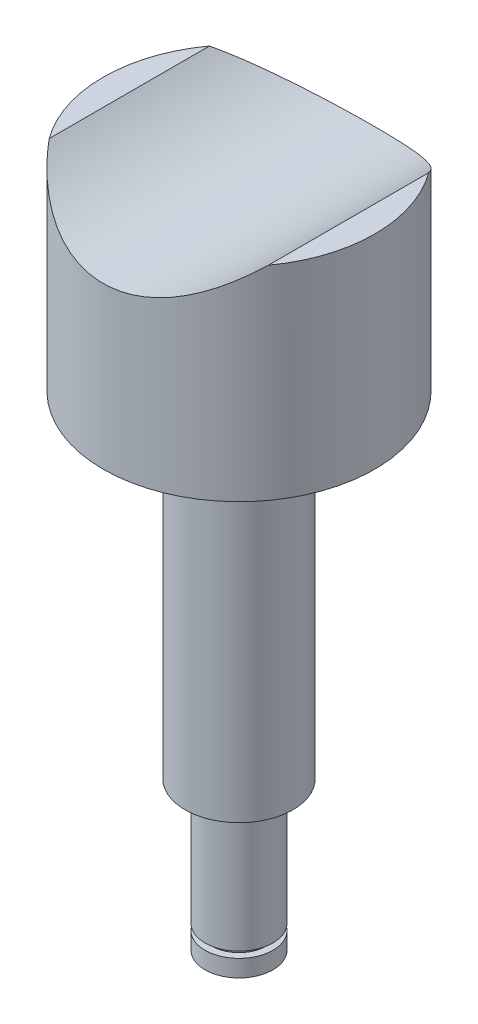
ISO-10303-21;
HEADER;
FILE_DESCRIPTION(('STEP AP214'),'2;1');
FILE_NAME('part.step','',(''),(''),'','','');
FILE_SCHEMA(('AUTOMOTIVE_DESIGN { 1 0 10303 214 1 1 1 1 }'));
ENDSEC;
DATA;
#1=APPLICATION_CONTEXT('core data for automotive mechanical design processes');
#2=APPLICATION_PROTOCOL_DEFINITION('international standard','automotive_design',2000,#1);
#3=PRODUCT_CONTEXT('',#1,'mechanical');
#4=PRODUCT('Part','Part','',(#3));
#5=PRODUCT_RELATED_PRODUCT_CATEGORY('part','',(#4));
#6=PRODUCT_DEFINITION_FORMATION('','',#4);
#7=PRODUCT_DEFINITION_CONTEXT('part definition',#1,'design');
#8=PRODUCT_DEFINITION('design','',#6,#7);
#9=PRODUCT_DEFINITION_SHAPE('','',#8);
#10=(LENGTH_UNIT() NAMED_UNIT(*) SI_UNIT(.MILLI.,.METRE.));
#11=(NAMED_UNIT(*) PLANE_ANGLE_UNIT() SI_UNIT($,.RADIAN.));
#12=(NAMED_UNIT(*) SI_UNIT($,.STERADIAN.) SOLID_ANGLE_UNIT());
#13=UNCERTAINTY_MEASURE_WITH_UNIT(LENGTH_MEASURE(1.E-05),#10,'distance_accuracy_value','');
#14=(GEOMETRIC_REPRESENTATION_CONTEXT(3) GLOBAL_UNCERTAINTY_ASSIGNED_CONTEXT((#13)) GLOBAL_UNIT_ASSIGNED_CONTEXT((#10,
#11,#12)) REPRESENTATION_CONTEXT('',''));
#15=CARTESIAN_POINT('',(0.,0.,0.));
#16=DIRECTION('',(0.,0.,1.));
#17=DIRECTION('',(1.,0.,0.));
#18=AXIS2_PLACEMENT_3D('',#15,#16,#17);
#19=CARTESIAN_POINT('',(0.,-57.07,0.));
#20=DIRECTION('',(0.,1.,0.));
#21=DIRECTION('',(0.,0.,1.));
#22=AXIS2_PLACEMENT_3D('',#19,#20,#21);
#23=CYLINDRICAL_SURFACE('',#22,4.);
#24=CARTESIAN_POINT('',(0.,-39.57,0.));
#25=DIRECTION('',(0.,-1.,0.));
#26=DIRECTION('',(0.,0.,-1.));
#27=AXIS2_PLACEMENT_3D('',#24,#25,#26);
#28=CIRCLE('',#27,4.);
#29=CARTESIAN_POINT('',(0.,-39.57,-4.));
#30=VERTEX_POINT('',#29);
#31=EDGE_CURVE('E71',#30,#30,#28,.T.);
#32=ORIENTED_EDGE('',*,*,#31,.T.);
#33=EDGE_LOOP('',(#32));
#34=FACE_BOUND('',#33,.T.);
#35=CARTESIAN_POINT('',(0.,-54.33,0.));
#36=DIRECTION('',(0.,-1.,0.));
#37=DIRECTION('',(0.,0.,-1.));
#38=AXIS2_PLACEMENT_3D('',#35,#36,#37);
#39=CIRCLE('',#38,4.);
#40=CARTESIAN_POINT('',(0.,-54.33,-4.));
#41=VERTEX_POINT('',#40);
#42=EDGE_CURVE('E38',#41,#41,#39,.T.);
#43=ORIENTED_EDGE('',*,*,#42,.F.);
#44=EDGE_LOOP('',(#43));
#45=FACE_BOUND('',#44,.T.);
#46=ADVANCED_FACE('F33',(#34,#45),#23,.T.);
#47=CARTESIAN_POINT('',(0.,24.,0.));
#48=DIRECTION('',(0.,1.,0.));
#49=DIRECTION('',(0.,0.,1.));
#50=AXIS2_PLACEMENT_3D('',#47,#48,#49);
#51=PLANE('',#50);
#52=DIRECTION('',(0.,0.,1.));
#53=VECTOR('',#52,1.);
#54=CARTESIAN_POINT('',(-12.9190750442901,24.,-16.));
#55=LINE('',#54,#53);
#56=CARTESIAN_POINT('',(-12.9190750442901,24.,-9.43914720724282));
#57=VERTEX_POINT('',#56);
#58=CARTESIAN_POINT('',(-12.9190750442901,24.,9.43914720724282));
#59=VERTEX_POINT('',#58);
#60=EDGE_CURVE('E11',#57,#59,#55,.T.);
#61=ORIENTED_EDGE('',*,*,#60,.F.);
#62=CARTESIAN_POINT('',(0.,24.,0.));
#63=DIRECTION('',(0.,1.,0.));
#64=DIRECTION('',(0.,0.,1.));
#65=AXIS2_PLACEMENT_3D('',#62,#63,#64);
#66=CIRCLE('',#65,16.);
#67=EDGE_CURVE('E66',#57,#59,#66,.T.);
#68=ORIENTED_EDGE('',*,*,#67,.T.);
#69=EDGE_LOOP('',(#61,#68));
#70=FACE_BOUND('',#69,.T.);
#71=ADVANCED_FACE('F133',(#70),#51,.T.);
#72=CARTESIAN_POINT('',(0.,24.,0.));
#73=DIRECTION('',(0.,-1.,0.));
#74=DIRECTION('',(0.,0.,-1.));
#75=AXIS2_PLACEMENT_3D('',#72,#73,#74);
#76=CYLINDRICAL_SURFACE('',#75,16.);
#77=CARTESIAN_POINT('',(12.9190750442901,24.,9.43914720724282));
#78=VERTEX_POINT('',#77);
#79=CARTESIAN_POINT('',(12.9190750442901,24.,-9.43914720724282));
#80=VERTEX_POINT('',#79);
#81=EDGE_CURVE('E64',#78,#80,#66,.T.);
#82=ORIENTED_EDGE('',*,*,#81,.F.);
#83=CARTESIAN_POINT('',(12.9190750442901,24.,9.43914720724282));
#84=CARTESIAN_POINT('',(12.7848745001724,23.8761583557703,9.62280970922538));
#85=CARTESIAN_POINT('',(12.6467891641811,23.752310488911,9.80359435033626));
#86=CARTESIAN_POINT('',(12.3628092535599,23.5052124607396,10.1593710354687));
#87=CARTESIAN_POINT('',(12.2169141322659,23.3819623419287,10.3343626726044));
#88=CARTESIAN_POINT('',(11.7671642976749,23.013788655781,10.8509215085894));
#89=CARTESIAN_POINT('',(11.4515310504343,22.7707083999413,11.1836808844152));
#90=CARTESIAN_POINT('',(10.786241112084,22.292396119069,11.826784210597));
#91=CARTESIAN_POINT('',(10.4363246798641,22.0572456050393,12.1369200712997));
#92=CARTESIAN_POINT('',(9.70491021094698,21.6017485773638,12.7293353217599));
#93=CARTESIAN_POINT('',(9.32342920414841,21.3813941955898,13.0116295548882));
#94=CARTESIAN_POINT('',(8.6119302918267,21.0040021911267,13.4899319557024));
#95=CARTESIAN_POINT('',(8.28769188992414,20.8433226617135,13.6916804147402));
#96=CARTESIAN_POINT('',(7.62029759857008,20.5366561014405,14.0740515301925));
#97=CARTESIAN_POINT('',(7.27714256924571,20.3906684034039,14.2546751459765));
#98=CARTESIAN_POINT('',(6.57390793423437,20.1162562003025,14.5923073857071));
#99=CARTESIAN_POINT('',(6.21387691990333,19.9877849876245,14.7493789274354));
#100=CARTESIAN_POINT('',(5.4775768478831,19.750390612657,15.0383687013548));
#101=CARTESIAN_POINT('',(5.10130784483666,19.6414673845927,15.1702870181814));
#102=CARTESIAN_POINT('',(4.33085324490416,19.4445196642634,15.4080444053685));
#103=CARTESIAN_POINT('',(3.93652581885725,19.3567156967325,15.5136086887214));
#104=CARTESIAN_POINT('',(3.1364381569893,19.2055602726033,15.6949347024083));
#105=CARTESIAN_POINT('',(2.73067779239335,19.1422090915472,15.7706960969137));
#106=CARTESIAN_POINT('',(1.91141192442762,19.0416435230316,15.8908105487804));
#107=CARTESIAN_POINT('',(1.49790827828065,19.0044229485463,15.9351710410527));
#108=CARTESIAN_POINT('',(0.667179964686915,18.957143948551,15.9915010830839));
#109=CARTESIAN_POINT('',(0.2499558715571,18.9470814011261,16.0034755482392));
#110=CARTESIAN_POINT('',(-0.523849027104041,18.9538563569469,15.9954080056797));
#111=CARTESIAN_POINT('',(-0.880519589543668,18.9670324150639,15.9797238955904));
#112=CARTESIAN_POINT('',(-1.59070567118655,19.0131958112954,15.9247122492311));
#113=CARTESIAN_POINT('',(-1.9442215519164,19.0461808489253,15.8853874584339));
#114=CARTESIAN_POINT('',(-2.64549912365194,19.1312800489046,15.7837531068547));
#115=CARTESIAN_POINT('',(-2.9932620119545,19.1833901772911,15.7214483931029));
#116=CARTESIAN_POINT('',(-3.68085735219408,19.3057296582209,15.5748154528326));
#117=CARTESIAN_POINT('',(-4.0206894699718,19.3759597727437,15.4904863001431));
#118=CARTESIAN_POINT('',(-4.68746831588913,19.5325587640499,15.3018503663848));
#119=CARTESIAN_POINT('',(-5.01450324870717,19.6187773126467,15.1977294620245));
#120=CARTESIAN_POINT('',(-5.65733509226059,19.8063424220213,14.9703309069064));
#121=CARTESIAN_POINT('',(-5.9731323736633,19.9076884832532,14.8470538887228));
#122=CARTESIAN_POINT('',(-6.59256235699274,20.1240850380026,14.5825794085774));
#123=CARTESIAN_POINT('',(-6.89618575757643,20.2391457531294,14.4413685752436));
#124=CARTESIAN_POINT('',(-7.49019632177865,20.4813699721994,14.1424032312224));
#125=CARTESIAN_POINT('',(-7.78058080643954,20.608535909757,13.9846453932999));
#126=CARTESIAN_POINT('',(-8.4716676918878,20.9314417308649,13.5813673069357));
#127=CARTESIAN_POINT('',(-8.86499511436966,21.1328252297615,13.327667013196));
#128=CARTESIAN_POINT('',(-9.62204756133403,21.5529247676398,12.7918516129014));
#129=CARTESIAN_POINT('',(-9.98575839234745,21.7716490190637,12.5097230255879));
#130=CARTESIAN_POINT('',(-10.6830317259132,22.2219279529263,11.9197901714817));
#131=CARTESIAN_POINT('',(-11.0165955856249,22.4534820570317,11.6119870617081));
#132=CARTESIAN_POINT('',(-11.6534098230203,22.9249429524403,10.9727612169663));
#133=CARTESIAN_POINT('',(-11.9566761720734,23.164845252085,10.6413510859996));
#134=CARTESIAN_POINT('',(-12.3623361595762,23.5052181473369,10.1590330668648));
#135=CARTESIAN_POINT('',(-12.4773278773615,23.6041235393927,10.0174615480245));
#136=CARTESIAN_POINT('',(-12.7020581330488,23.8020218706093,9.73091864962274));
#137=CARTESIAN_POINT('',(-12.8118076675977,23.9010141388815,9.5859554317504));
#138=CARTESIAN_POINT('',(-12.9190750442901,24.,9.43914720724282));
#139=B_SPLINE_CURVE_WITH_KNOTS('',3,(#83,#84,#85,#86,#87,#88,#89,#90,#91,#92,#93,#94,#95,#96,
#97,#98,#99,#100,#101,#102,#103,#104,#105,#106,#107,#108,#109,#110,#111,#112,#113,#114,#115,
#116,#117,#118,#119,#120,#121,#122,#123,#124,#125,#126,#127,#128,#129,#130,#131,#132,#133,#134,
#135,#136,#137,#138),.UNSPECIFIED.,.F.,.F.,(4,2,2,2,2,2,2,2,2,2,2,2,2,2,2,2,2,2,2,2,2,2,2,2,2,2,
2,4),(0.,0.776888789045753,1.55383202951762,3.10937464524043,4.67777913047947,6.24534287096398,
7.48715419274499,8.72890909664628,9.96728525692639,11.205657250249,12.4564475738849,
13.7072519914325,14.9577601521122,16.2080785059883,17.2785335984171,18.3488643992648,
19.4189695700411,20.4891197480912,21.5496760480846,22.6101973337654,23.6715140332741,
24.7330445506064,26.2594200737803,27.7865228446537,29.3135568339828,30.8397815502439,
31.4621472957398,32.0831443333162),.UNSPECIFIED.);
#140=EDGE_CURVE('E50',#78,#59,#139,.T.);
#141=ORIENTED_EDGE('',*,*,#140,.T.);
#142=ORIENTED_EDGE('',*,*,#67,.F.);
#143=CARTESIAN_POINT('',(-12.9190750442901,24.,-9.43914720724282));
#144=CARTESIAN_POINT('',(-12.7848745001724,23.8761583557703,-9.62280970922538));
#145=CARTESIAN_POINT('',(-12.6467891641811,23.752310488911,-9.80359435033626));
#146=CARTESIAN_POINT('',(-12.3628092535599,23.5052124607396,-10.1593710354687));
#147=CARTESIAN_POINT('',(-12.2169141322659,23.3819623419287,-10.3343626726044));
#148=CARTESIAN_POINT('',(-11.7671642976749,23.013788655781,-10.8509215085894));
#149=CARTESIAN_POINT('',(-11.4515310504343,22.7707083999413,-11.1836808844152));
#150=CARTESIAN_POINT('',(-10.786241112084,22.292396119069,-11.826784210597));
#151=CARTESIAN_POINT('',(-10.4363246798641,22.0572456050393,-12.1369200712997));
#152=CARTESIAN_POINT('',(-9.70491021094698,21.6017485773638,-12.7293353217599));
#153=CARTESIAN_POINT('',(-9.32342920414841,21.3813941955898,-13.0116295548882));
#154=CARTESIAN_POINT('',(-8.6119302918267,21.0040021911267,-13.4899319557024));
#155=CARTESIAN_POINT('',(-8.28769188992414,20.8433226617135,-13.6916804147402));
#156=CARTESIAN_POINT('',(-7.62029759857008,20.5366561014405,-14.0740515301925));
#157=CARTESIAN_POINT('',(-7.27714256924571,20.3906684034039,-14.2546751459765));
#158=CARTESIAN_POINT('',(-6.57390793423437,20.1162562003025,-14.5923073857071));
#159=CARTESIAN_POINT('',(-6.21387691990333,19.9877849876245,-14.7493789274354));
#160=CARTESIAN_POINT('',(-5.4775768478831,19.750390612657,-15.0383687013548));
#161=CARTESIAN_POINT('',(-5.10130784483666,19.6414673845927,-15.1702870181814));
#162=CARTESIAN_POINT('',(-4.33085324490416,19.4445196642634,-15.4080444053685));
#163=CARTESIAN_POINT('',(-3.93652581885725,19.3567156967325,-15.5136086887214));
#164=CARTESIAN_POINT('',(-3.1364381569893,19.2055602726033,-15.6949347024083));
#165=CARTESIAN_POINT('',(-2.73067779239335,19.1422090915472,-15.7706960969137));
#166=CARTESIAN_POINT('',(-1.91141192442762,19.0416435230316,-15.8908105487804));
#167=CARTESIAN_POINT('',(-1.49790827828065,19.0044229485463,-15.9351710410527));
#168=CARTESIAN_POINT('',(-0.667179964686915,18.957143948551,-15.9915010830839));
#169=CARTESIAN_POINT('',(-0.2499558715571,18.9470814011261,-16.0034755482392));
#170=CARTESIAN_POINT('',(0.523849027104041,18.9538563569469,-15.9954080056797));
#171=CARTESIAN_POINT('',(0.880519589543668,18.9670324150639,-15.9797238955904));
#172=CARTESIAN_POINT('',(1.59070567118655,19.0131958112954,-15.9247122492311));
#173=CARTESIAN_POINT('',(1.9442215519164,19.0461808489253,-15.8853874584339));
#174=CARTESIAN_POINT('',(2.64549912365194,19.1312800489046,-15.7837531068547));
#175=CARTESIAN_POINT('',(2.9932620119545,19.1833901772911,-15.7214483931029));
#176=CARTESIAN_POINT('',(3.68085735219408,19.3057296582209,-15.5748154528326));
#177=CARTESIAN_POINT('',(4.0206894699718,19.3759597727437,-15.4904863001431));
#178=CARTESIAN_POINT('',(4.68746831588913,19.5325587640499,-15.3018503663848));
#179=CARTESIAN_POINT('',(5.01450324870717,19.6187773126467,-15.1977294620245));
#180=CARTESIAN_POINT('',(5.65733509226059,19.8063424220213,-14.9703309069064));
#181=CARTESIAN_POINT('',(5.9731323736633,19.9076884832532,-14.8470538887228));
#182=CARTESIAN_POINT('',(6.59256235699274,20.1240850380026,-14.5825794085774));
#183=CARTESIAN_POINT('',(6.89618575757643,20.2391457531294,-14.4413685752436));
#184=CARTESIAN_POINT('',(7.49019632177865,20.4813699721994,-14.1424032312224));
#185=CARTESIAN_POINT('',(7.78058080643954,20.608535909757,-13.9846453932999));
#186=CARTESIAN_POINT('',(8.4716676918878,20.9314417308649,-13.5813673069357));
#187=CARTESIAN_POINT('',(8.86499511436966,21.1328252297615,-13.327667013196));
#188=CARTESIAN_POINT('',(9.62204756133403,21.5529247676398,-12.7918516129014));
#189=CARTESIAN_POINT('',(9.98575839234745,21.7716490190637,-12.5097230255879));
#190=CARTESIAN_POINT('',(10.6830317259132,22.2219279529263,-11.9197901714817));
#191=CARTESIAN_POINT('',(11.0165955856249,22.4534820570317,-11.6119870617081));
#192=CARTESIAN_POINT('',(11.6534098230203,22.9249429524403,-10.9727612169663));
#193=CARTESIAN_POINT('',(11.9566761720734,23.164845252085,-10.6413510859996));
#194=CARTESIAN_POINT('',(12.3623361595762,23.5052181473369,-10.1590330668648));
#195=CARTESIAN_POINT('',(12.4773278773615,23.6041235393927,-10.0174615480245));
#196=CARTESIAN_POINT('',(12.7020581330488,23.8020218706093,-9.73091864962274));
#197=CARTESIAN_POINT('',(12.8118076675977,23.9010141388815,-9.5859554317504));
#198=CARTESIAN_POINT('',(12.9190750442901,24.,-9.43914720724282));
#199=B_SPLINE_CURVE_WITH_KNOTS('',3,(#143,#144,#145,#146,#147,#148,#149,#150,#151,#152,#153,
#154,#155,#156,#157,#158,#159,#160,#161,#162,#163,#164,#165,#166,#167,#168,#169,#170,#171,#172,
#173,#174,#175,#176,#177,#178,#179,#180,#181,#182,#183,#184,#185,#186,#187,#188,#189,#190,#191,
#192,#193,#194,#195,#196,#197,#198),.UNSPECIFIED.,.F.,.F.,(4,2,2,2,2,2,2,2,2,2,2,2,2,2,2,2,2,2,
2,2,2,2,2,2,2,2,2,4),(0.,0.776888789045753,1.55383202951762,3.10937464524043,4.67777913047947,
6.24534287096398,7.48715419274499,8.72890909664628,9.96728525692639,11.205657250249,
12.4564475738849,13.7072519914325,14.9577601521122,16.2080785059883,17.2785335984171,
18.3488643992648,19.4189695700411,20.4891197480912,21.5496760480846,22.6101973337654,
23.6715140332741,24.7330445506064,26.2594200737803,27.7865228446537,29.3135568339828,
30.8397815502439,31.4621472957398,32.0831443333162),.UNSPECIFIED.);
#200=EDGE_CURVE('E61',#57,#80,#199,.T.);
#201=ORIENTED_EDGE('',*,*,#200,.T.);
#202=EDGE_LOOP('',(#82,#141,#142,#201));
#203=FACE_BOUND('',#202,.T.);
#204=CARTESIAN_POINT('',(0.,0.,0.));
#205=DIRECTION('',(0.,1.,0.));
#206=DIRECTION('',(0.,0.,1.));
#207=AXIS2_PLACEMENT_3D('',#204,#205,#206);
#208=CIRCLE('',#207,16.);
#209=CARTESIAN_POINT('',(0.,0.,16.));
#210=VERTEX_POINT('',#209);
#211=EDGE_CURVE('E78',#210,#210,#208,.T.);
#212=ORIENTED_EDGE('',*,*,#211,.T.);
#213=EDGE_LOOP('',(#212));
#214=FACE_BOUND('',#213,.T.);
#215=ADVANCED_FACE('F35',(#203,#214),#76,.T.);
#216=DIRECTION('',(0.,0.,1.));
#217=VECTOR('',#216,1.);
#218=CARTESIAN_POINT('',(12.9190750442901,24.,-16.));
#219=LINE('',#218,#217);
#220=EDGE_CURVE('E43',#78,#80,#219,.F.);
#221=ORIENTED_EDGE('',*,*,#220,.F.);
#222=ORIENTED_EDGE('',*,*,#81,.T.);
#223=EDGE_LOOP('',(#221,#222));
#224=FACE_BOUND('',#223,.T.);
#225=ADVANCED_FACE('F73',(#224),#51,.T.);
#226=CARTESIAN_POINT('',(0.,0.,0.));
#227=DIRECTION('',(0.,1.,0.));
#228=DIRECTION('',(0.,0.,1.));
#229=AXIS2_PLACEMENT_3D('',#226,#227,#228);
#230=PLANE('',#229);
#231=CARTESIAN_POINT('',(0.,0.,0.));
#232=DIRECTION('',(0.,-1.,0.));
#233=DIRECTION('',(0.,0.,-1.));
#234=AXIS2_PLACEMENT_3D('',#231,#232,#233);
#235=CIRCLE('',#234,6.35);
#236=CARTESIAN_POINT('',(0.,0.,-6.35));
#237=VERTEX_POINT('',#236);
#238=EDGE_CURVE('E74',#237,#237,#235,.T.);
#239=ORIENTED_EDGE('',*,*,#238,.F.);
#240=EDGE_LOOP('',(#239));
#241=FACE_BOUND('',#240,.T.);
#242=ORIENTED_EDGE('',*,*,#211,.F.);
#243=EDGE_LOOP('',(#242));
#244=FACE_BOUND('',#243,.T.);
#245=ADVANCED_FACE('F130',(#241,#244),#230,.F.);
#246=CARTESIAN_POINT('',(0.,-39.57,0.));
#247=DIRECTION('',(0.,1.,0.));
#248=DIRECTION('',(0.,0.,1.));
#249=AXIS2_PLACEMENT_3D('',#246,#247,#248);
#250=CYLINDRICAL_SURFACE('',#249,6.35);
#251=CARTESIAN_POINT('',(0.,-39.57,0.));
#252=DIRECTION('',(0.,-1.,0.));
#253=DIRECTION('',(0.,0.,-1.));
#254=AXIS2_PLACEMENT_3D('',#251,#252,#253);
#255=CIRCLE('',#254,6.35);
#256=CARTESIAN_POINT('',(0.,-39.57,-6.35));
#257=VERTEX_POINT('',#256);
#258=EDGE_CURVE('E82',#257,#257,#255,.T.);
#259=ORIENTED_EDGE('',*,*,#258,.F.);
#260=EDGE_LOOP('',(#259));
#261=FACE_BOUND('',#260,.T.);
#262=ORIENTED_EDGE('',*,*,#238,.T.);
#263=EDGE_LOOP('',(#262));
#264=FACE_BOUND('',#263,.T.);
#265=ADVANCED_FACE('F126',(#261,#264),#250,.T.);
#266=CARTESIAN_POINT('',(0.,-39.57,0.));
#267=DIRECTION('',(0.,-1.,0.));
#268=DIRECTION('',(0.,0.,-1.));
#269=AXIS2_PLACEMENT_3D('',#266,#267,#268);
#270=PLANE('',#269);
#271=ORIENTED_EDGE('',*,*,#31,.F.);
#272=EDGE_LOOP('',(#271));
#273=FACE_BOUND('',#272,.T.);
#274=ORIENTED_EDGE('',*,*,#258,.T.);
#275=EDGE_LOOP('',(#274));
#276=FACE_BOUND('',#275,.T.);
#277=ADVANCED_FACE('F112',(#273,#276),#270,.T.);
#278=CARTESIAN_POINT('',(0.,38.,-16.));
#279=DIRECTION('',(0.,0.,1.));
#280=DIRECTION('',(1.,0.,0.));
#281=AXIS2_PLACEMENT_3D('',#278,#279,#280);
#282=CYLINDRICAL_SURFACE('',#281,19.05);
#283=ORIENTED_EDGE('',*,*,#140,.F.);
#284=ORIENTED_EDGE('',*,*,#220,.T.);
#285=ORIENTED_EDGE('',*,*,#200,.F.);
#286=ORIENTED_EDGE('',*,*,#60,.T.);
#287=EDGE_LOOP('',(#283,#284,#285,#286));
#288=FACE_BOUND('',#287,.T.);
#289=ADVANCED_FACE('F69',(#288),#282,.F.);
#290=CARTESIAN_POINT('',(0.,-54.33,0.));
#291=DIRECTION('',(0.,-1.,0.));
#292=DIRECTION('',(0.,0.,-1.));
#293=AXIS2_PLACEMENT_3D('',#290,#291,#292);
#294=PLANE('',#293);
#295=CARTESIAN_POINT('',(0.,-54.33,0.));
#296=DIRECTION('',(0.,-1.,0.));
#297=DIRECTION('',(0.,0.,-1.));
#298=AXIS2_PLACEMENT_3D('',#295,#296,#297);
#299=CIRCLE('',#298,3.175);
#300=CARTESIAN_POINT('',(0.,-54.33,-3.175));
#301=VERTEX_POINT('',#300);
#302=EDGE_CURVE('E85',#301,#301,#299,.T.);
#303=ORIENTED_EDGE('',*,*,#302,.F.);
#304=EDGE_LOOP('',(#303));
#305=FACE_BOUND('',#304,.T.);
#306=ORIENTED_EDGE('',*,*,#42,.T.);
#307=EDGE_LOOP('',(#306));
#308=FACE_BOUND('',#307,.T.);
#309=ADVANCED_FACE('F111',(#305,#308),#294,.T.);
#310=CARTESIAN_POINT('',(0.,-55.07,0.));
#311=DIRECTION('',(0.,-1.,0.));
#312=DIRECTION('',(0.,0.,-1.));
#313=AXIS2_PLACEMENT_3D('',#310,#311,#312);
#314=PLANE('',#313);
#315=CARTESIAN_POINT('',(0.,-55.07,0.));
#316=DIRECTION('',(0.,-1.,0.));
#317=DIRECTION('',(0.,0.,-1.));
#318=AXIS2_PLACEMENT_3D('',#315,#316,#317);
#319=CIRCLE('',#318,3.175);
#320=CARTESIAN_POINT('',(0.,-55.07,-3.175));
#321=VERTEX_POINT('',#320);
#322=EDGE_CURVE('E90',#321,#321,#319,.T.);
#323=ORIENTED_EDGE('',*,*,#322,.T.);
#324=EDGE_LOOP('',(#323));
#325=FACE_BOUND('',#324,.T.);
#326=CARTESIAN_POINT('',(0.,-55.07,0.));
#327=DIRECTION('',(0.,-1.,0.));
#328=DIRECTION('',(0.,0.,-1.));
#329=AXIS2_PLACEMENT_3D('',#326,#327,#328);
#330=CIRCLE('',#329,4.);
#331=CARTESIAN_POINT('',(0.,-55.07,-4.));
#332=VERTEX_POINT('',#331);
#333=EDGE_CURVE('E83',#332,#332,#330,.T.);
#334=ORIENTED_EDGE('',*,*,#333,.F.);
#335=EDGE_LOOP('',(#334));
#336=FACE_BOUND('',#335,.T.);
#337=ADVANCED_FACE('F113',(#325,#336),#314,.F.);
#338=CARTESIAN_POINT('',(0.,-54.33,0.));
#339=DIRECTION('',(0.,-1.,0.));
#340=DIRECTION('',(0.,0.,-1.));
#341=AXIS2_PLACEMENT_3D('',#338,#339,#340);
#342=CYLINDRICAL_SURFACE('',#341,3.175);
#343=ORIENTED_EDGE('',*,*,#302,.T.);
#344=EDGE_LOOP('',(#343));
#345=FACE_BOUND('',#344,.T.);
#346=ORIENTED_EDGE('',*,*,#322,.F.);
#347=EDGE_LOOP('',(#346));
#348=FACE_BOUND('',#347,.T.);
#349=ADVANCED_FACE('F120',(#345,#348),#342,.T.);
#350=CARTESIAN_POINT('',(0.,-57.07,0.));
#351=DIRECTION('',(0.,-1.,0.));
#352=DIRECTION('',(0.,0.,-1.));
#353=AXIS2_PLACEMENT_3D('',#350,#351,#352);
#354=PLANE('',#353);
#355=CARTESIAN_POINT('',(0.,-57.07,0.));
#356=DIRECTION('',(0.,-1.,0.));
#357=DIRECTION('',(0.,0.,-1.));
#358=AXIS2_PLACEMENT_3D('',#355,#356,#357);
#359=CIRCLE('',#358,4.);
#360=CARTESIAN_POINT('',(0.,-57.07,-4.));
#361=VERTEX_POINT('',#360);
#362=EDGE_CURVE('E236',#361,#361,#359,.T.);
#363=ORIENTED_EDGE('',*,*,#362,.T.);
#364=EDGE_LOOP('',(#363));
#365=FACE_BOUND('',#364,.T.);
#366=ADVANCED_FACE('F115',(#365),#354,.T.);
#367=ORIENTED_EDGE('',*,*,#333,.T.);
#368=EDGE_LOOP('',(#367));
#369=FACE_BOUND('',#368,.T.);
#370=ORIENTED_EDGE('',*,*,#362,.F.);
#371=EDGE_LOOP('',(#370));
#372=FACE_BOUND('',#371,.T.);
#373=ADVANCED_FACE('F119',(#369,#372),#23,.T.);
#374=CLOSED_SHELL('',(#46,#71,#215,#225,#245,#265,#277,#289,#309,#337,#349,#366,#373));
#375=MANIFOLD_SOLID_BREP('B2',#374);
#376=ADVANCED_BREP_SHAPE_REPRESENTATION('',(#18,#375),#14);
#377=SHAPE_DEFINITION_REPRESENTATION(#9,#376);
ENDSEC;
END-ISO-10303-21;
